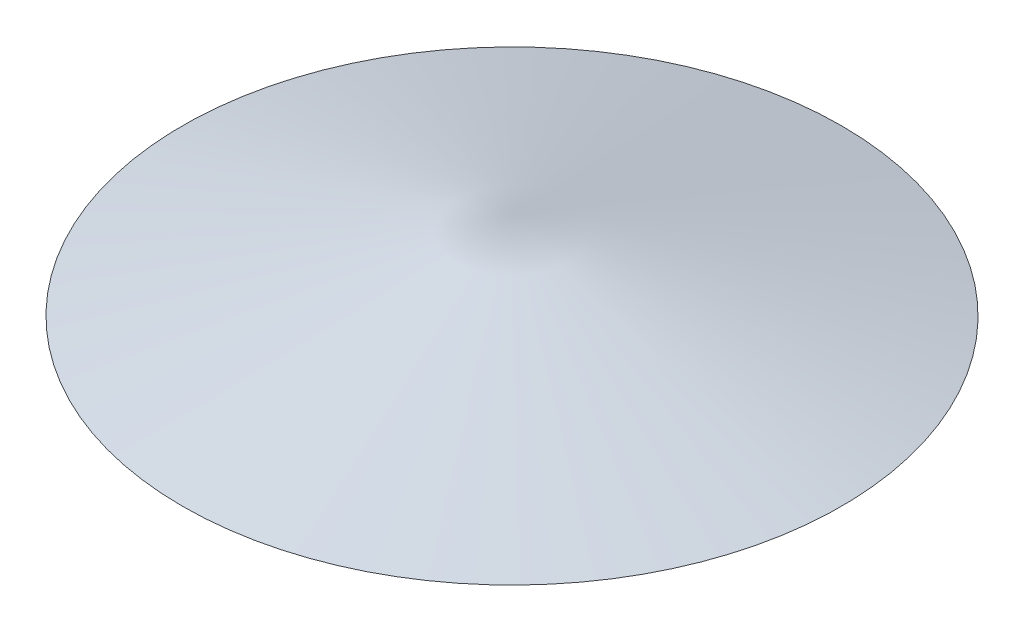
ISO-10303-21;
HEADER;
FILE_DESCRIPTION(('STEP AP214'),'2;1');
FILE_NAME('part.step','',(''),(''),'','','');
FILE_SCHEMA(('AUTOMOTIVE_DESIGN { 1 0 10303 214 1 1 1 1 }'));
ENDSEC;
DATA;
#1=APPLICATION_CONTEXT('core data for automotive mechanical design processes');
#2=APPLICATION_PROTOCOL_DEFINITION('international standard','automotive_design',2000,#1);
#3=PRODUCT_CONTEXT('',#1,'mechanical');
#4=PRODUCT('Part','Part','',(#3));
#5=PRODUCT_RELATED_PRODUCT_CATEGORY('part','',(#4));
#6=PRODUCT_DEFINITION_FORMATION('','',#4);
#7=PRODUCT_DEFINITION_CONTEXT('part definition',#1,'design');
#8=PRODUCT_DEFINITION('design','',#6,#7);
#9=PRODUCT_DEFINITION_SHAPE('','',#8);
#10=(LENGTH_UNIT() NAMED_UNIT(*) SI_UNIT(.MILLI.,.METRE.));
#11=(NAMED_UNIT(*) PLANE_ANGLE_UNIT() SI_UNIT($,.RADIAN.));
#12=(NAMED_UNIT(*) SI_UNIT($,.STERADIAN.) SOLID_ANGLE_UNIT());
#13=UNCERTAINTY_MEASURE_WITH_UNIT(LENGTH_MEASURE(1.E-05),#10,'distance_accuracy_value','');
#14=(GEOMETRIC_REPRESENTATION_CONTEXT(3) GLOBAL_UNCERTAINTY_ASSIGNED_CONTEXT((#13)) GLOBAL_UNIT_ASSIGNED_CONTEXT((#10,
#11,#12)) REPRESENTATION_CONTEXT('',''));
#15=CARTESIAN_POINT('',(0.,0.,0.));
#16=DIRECTION('',(0.,0.,1.));
#17=DIRECTION('',(1.,0.,0.));
#18=AXIS2_PLACEMENT_3D('',#15,#16,#17);
#19=CARTESIAN_POINT('',(746.410161513763,0.,0.));
#20=DIRECTION('',(0.,-1.,0.));
#21=DIRECTION('',(0.,0.,-1.));
#22=AXIS2_PLACEMENT_3D('',#19,#20,#21);
#23=PLANE('',#22);
#24=CARTESIAN_POINT('',(0.,0.,0.));
#25=DIRECTION('',(0.,-1.,0.));
#26=DIRECTION('',(0.,0.,-1.));
#27=AXIS2_PLACEMENT_3D('',#24,#25,#26);
#28=CIRCLE('',#27,746.410161513763);
#29=CARTESIAN_POINT('',(0.,0.,-746.410161513763));
#30=VERTEX_POINT('',#29);
#31=EDGE_CURVE('E11',#30,#30,#28,.T.);
#32=ORIENTED_EDGE('',*,*,#31,.T.);
#33=EDGE_LOOP('',(#32));
#34=FACE_BOUND('',#33,.T.);
#35=ADVANCED_FACE('F37',(#34),#23,.T.);
#36=CARTESIAN_POINT('',(0.,0.,0.));
#37=DIRECTION('',(0.,-1.,0.));
#38=DIRECTION('',(0.,0.,-1.));
#39=AXIS2_PLACEMENT_3D('',#36,#37,#38);
#40=CONICAL_SURFACE('',#39,746.410161513763,1.30899693899574);
#41=CARTESIAN_POINT('',(0.,200.,0.));
#42=VERTEX_POINT('',#41);
#43=VERTEX_LOOP('',#42);
#44=FACE_BOUND('',#43,.T.);
#45=ORIENTED_EDGE('',*,*,#31,.F.);
#46=EDGE_LOOP('',(#45));
#47=FACE_BOUND('',#46,.T.);
#48=ADVANCED_FACE('F44',(#44,#47),#40,.T.);
#49=CLOSED_SHELL('',(#35,#48));
#50=MANIFOLD_SOLID_BREP('B2',#49);
#51=ADVANCED_BREP_SHAPE_REPRESENTATION('',(#18,#50),#14);
#52=SHAPE_DEFINITION_REPRESENTATION(#9,#51);
ENDSEC;
END-ISO-10303-21;
